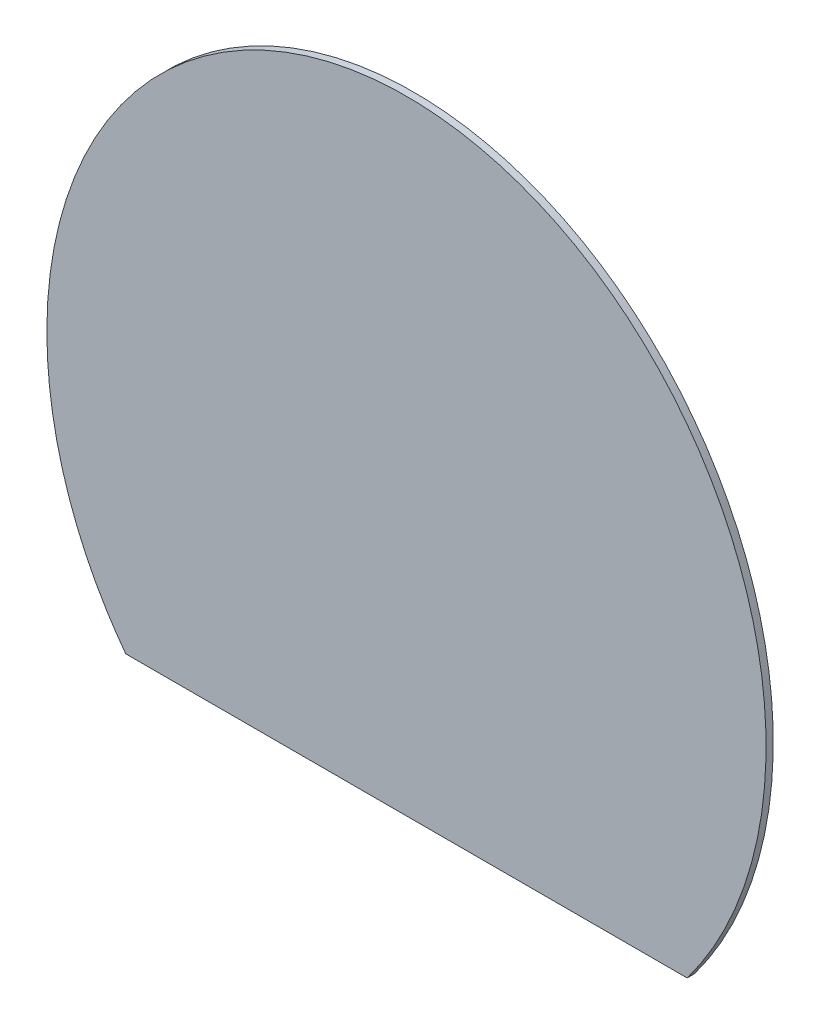
ISO-10303-21;
HEADER;
FILE_DESCRIPTION(('STEP AP214'),'2;1');
FILE_NAME('part.step','',(''),(''),'','','');
FILE_SCHEMA(('AUTOMOTIVE_DESIGN { 1 0 10303 214 1 1 1 1 }'));
ENDSEC;
DATA;
#1=APPLICATION_CONTEXT('core data for automotive mechanical design processes');
#2=APPLICATION_PROTOCOL_DEFINITION('international standard','automotive_design',2000,#1);
#3=PRODUCT_CONTEXT('',#1,'mechanical');
#4=PRODUCT('Part','Part','',(#3));
#5=PRODUCT_RELATED_PRODUCT_CATEGORY('part','',(#4));
#6=PRODUCT_DEFINITION_FORMATION('','',#4);
#7=PRODUCT_DEFINITION_CONTEXT('part definition',#1,'design');
#8=PRODUCT_DEFINITION('design','',#6,#7);
#9=PRODUCT_DEFINITION_SHAPE('','',#8);
#10=(LENGTH_UNIT() NAMED_UNIT(*) SI_UNIT(.MILLI.,.METRE.));
#11=(NAMED_UNIT(*) PLANE_ANGLE_UNIT() SI_UNIT($,.RADIAN.));
#12=(NAMED_UNIT(*) SI_UNIT($,.STERADIAN.) SOLID_ANGLE_UNIT());
#13=UNCERTAINTY_MEASURE_WITH_UNIT(LENGTH_MEASURE(1.E-05),#10,'distance_accuracy_value','');
#14=(GEOMETRIC_REPRESENTATION_CONTEXT(3) GLOBAL_UNCERTAINTY_ASSIGNED_CONTEXT((#13)) GLOBAL_UNIT_ASSIGNED_CONTEXT((#10,
#11,#12)) REPRESENTATION_CONTEXT('',''));
#15=CARTESIAN_POINT('',(0.,0.,0.));
#16=DIRECTION('',(0.,0.,1.));
#17=DIRECTION('',(1.,0.,0.));
#18=AXIS2_PLACEMENT_3D('',#15,#16,#17);
#19=CARTESIAN_POINT('',(0.,0.,1.5));
#20=DIRECTION('',(0.,0.,1.));
#21=DIRECTION('',(0.,1.,0.));
#22=AXIS2_PLACEMENT_3D('',#19,#20,#21);
#23=ELLIPSE('',#22,80.,75.);
#24=DIRECTION('',(0.,0.,-1.));
#25=VECTOR('',#24,1.);
#26=SURFACE_OF_LINEAR_EXTRUSION('',#23,#25);
#27=CARTESIAN_POINT('',(0.,0.,0.));
#28=DIRECTION('',(0.,0.,1.));
#29=DIRECTION('',(0.,1.,0.));
#30=AXIS2_PLACEMENT_3D('',#27,#28,#29);
#31=ELLIPSE('',#30,80.,75.);
#32=CARTESIAN_POINT('',(58.546856234985,-50.,0.));
#33=VERTEX_POINT('',#32);
#34=CARTESIAN_POINT('',(-58.546856234985,-50.,0.));
#35=VERTEX_POINT('',#34);
#36=EDGE_CURVE('E64',#33,#35,#31,.T.);
#37=ORIENTED_EDGE('',*,*,#36,.T.);
#38=DIRECTION('',(0.,0.,-1.));
#39=VECTOR('',#38,1.);
#40=CARTESIAN_POINT('',(-58.546856234985,-50.,1.5));
#41=LINE('',#40,#39);
#42=CARTESIAN_POINT('',(-58.546856234985,-50.,1.5));
#43=VERTEX_POINT('',#42);
#44=EDGE_CURVE('E11',#43,#35,#41,.T.);
#45=ORIENTED_EDGE('',*,*,#44,.F.);
#46=CARTESIAN_POINT('',(58.546856234985,-50.,1.5));
#47=VERTEX_POINT('',#46);
#48=EDGE_CURVE('E63',#47,#43,#23,.T.);
#49=ORIENTED_EDGE('',*,*,#48,.F.);
#50=DIRECTION('',(0.,0.,-1.));
#51=VECTOR('',#50,1.);
#52=CARTESIAN_POINT('',(58.546856234985,-50.,1.5));
#53=LINE('',#52,#51);
#54=EDGE_CURVE('E41',#47,#33,#53,.T.);
#55=ORIENTED_EDGE('',*,*,#54,.T.);
#56=EDGE_LOOP('',(#37,#45,#49,#55));
#57=FACE_BOUND('',#56,.T.);
#58=ADVANCED_FACE('F32',(#57),#26,.F.);
#59=CARTESIAN_POINT('',(-58.546856234985,-50.,1.5));
#60=DIRECTION('',(0.,1.,0.));
#61=DIRECTION('',(0.,0.,1.));
#62=AXIS2_PLACEMENT_3D('',#59,#60,#61);
#63=PLANE('',#62);
#64=DIRECTION('',(1.,0.,0.));
#65=VECTOR('',#64,1.);
#66=CARTESIAN_POINT('',(-58.546856234985,-50.,0.));
#67=LINE('',#66,#65);
#68=EDGE_CURVE('E56',#35,#33,#67,.T.);
#69=ORIENTED_EDGE('',*,*,#68,.T.);
#70=ORIENTED_EDGE('',*,*,#54,.F.);
#71=DIRECTION('',(1.,0.,0.));
#72=VECTOR('',#71,1.);
#73=CARTESIAN_POINT('',(-58.546856234985,-50.,1.5));
#74=LINE('',#73,#72);
#75=EDGE_CURVE('E48',#43,#47,#74,.T.);
#76=ORIENTED_EDGE('',*,*,#75,.F.);
#77=ORIENTED_EDGE('',*,*,#44,.T.);
#78=EDGE_LOOP('',(#69,#70,#76,#77));
#79=FACE_BOUND('',#78,.T.);
#80=ADVANCED_FACE('F59',(#79),#63,.F.);
#81=CARTESIAN_POINT('',(0.,0.,1.5));
#82=DIRECTION('',(0.,0.,1.));
#83=DIRECTION('',(1.,0.,0.));
#84=AXIS2_PLACEMENT_3D('',#81,#82,#83);
#85=PLANE('',#84);
#86=ORIENTED_EDGE('',*,*,#48,.T.);
#87=ORIENTED_EDGE('',*,*,#75,.T.);
#88=EDGE_LOOP('',(#86,#87));
#89=FACE_BOUND('',#88,.T.);
#90=ADVANCED_FACE('F71',(#89),#85,.T.);
#91=CARTESIAN_POINT('',(0.,0.,0.));
#92=DIRECTION('',(0.,0.,1.));
#93=DIRECTION('',(1.,0.,0.));
#94=AXIS2_PLACEMENT_3D('',#91,#92,#93);
#95=PLANE('',#94);
#96=ORIENTED_EDGE('',*,*,#36,.F.);
#97=ORIENTED_EDGE('',*,*,#68,.F.);
#98=EDGE_LOOP('',(#96,#97));
#99=FACE_BOUND('',#98,.T.);
#100=ADVANCED_FACE('F67',(#99),#95,.F.);
#101=CLOSED_SHELL('',(#58,#80,#90,#100));
#102=MANIFOLD_SOLID_BREP('B2',#101);
#103=ADVANCED_BREP_SHAPE_REPRESENTATION('',(#18,#102),#14);
#104=SHAPE_DEFINITION_REPRESENTATION(#9,#103);
ENDSEC;
END-ISO-10303-21;
